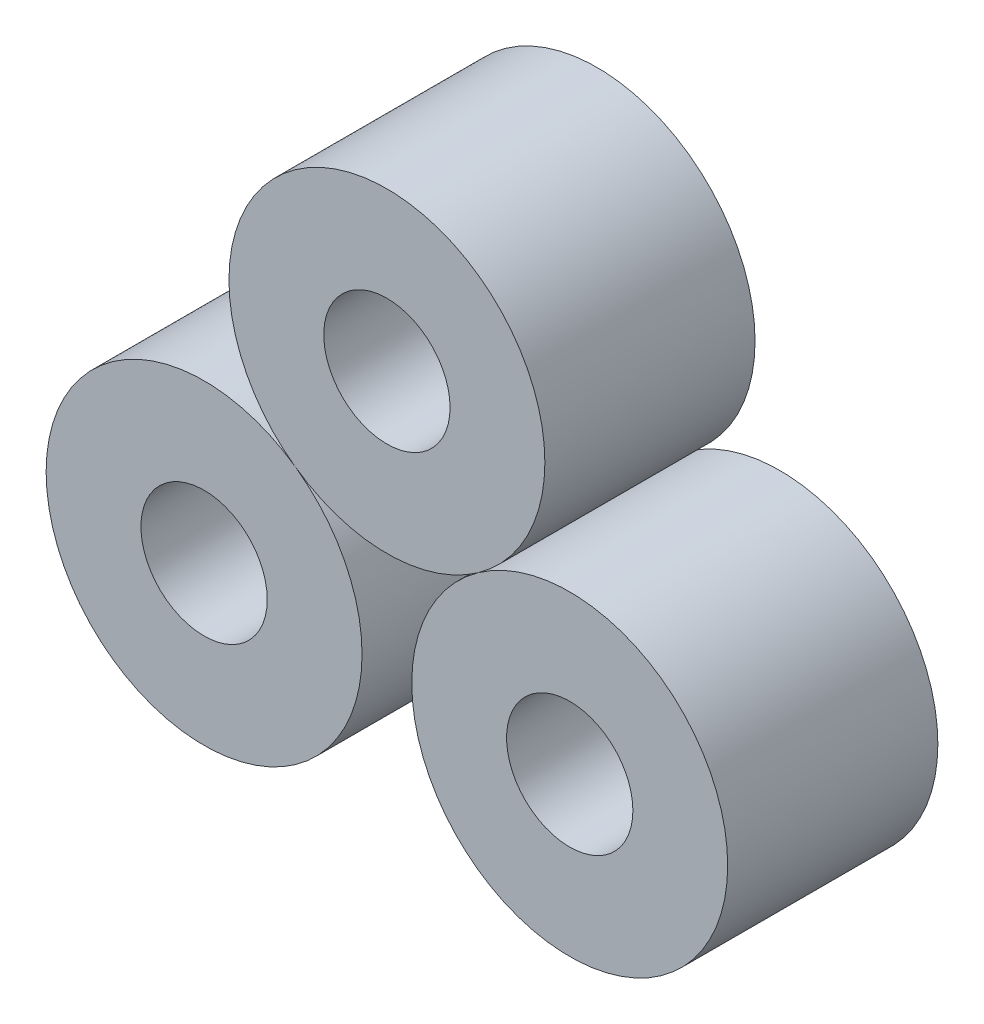
ISO-10303-21;
HEADER;
FILE_DESCRIPTION(('STEP AP214'),'2;1');
FILE_NAME('part.step','',(''),(''),'','','');
FILE_SCHEMA(('AUTOMOTIVE_DESIGN { 1 0 10303 214 1 1 1 1 }'));
ENDSEC;
DATA;
#1=APPLICATION_CONTEXT('core data for automotive mechanical design processes');
#2=APPLICATION_PROTOCOL_DEFINITION('international standard','automotive_design',2000,#1);
#3=PRODUCT_CONTEXT('',#1,'mechanical');
#4=PRODUCT('Part','Part','',(#3));
#5=PRODUCT_RELATED_PRODUCT_CATEGORY('part','',(#4));
#6=PRODUCT_DEFINITION_FORMATION('','',#4);
#7=PRODUCT_DEFINITION_CONTEXT('part definition',#1,'design');
#8=PRODUCT_DEFINITION('design','',#6,#7);
#9=PRODUCT_DEFINITION_SHAPE('','',#8);
#10=(LENGTH_UNIT() NAMED_UNIT(*) SI_UNIT(.MILLI.,.METRE.));
#11=(NAMED_UNIT(*) PLANE_ANGLE_UNIT() SI_UNIT($,.RADIAN.));
#12=(NAMED_UNIT(*) SI_UNIT($,.STERADIAN.) SOLID_ANGLE_UNIT());
#13=UNCERTAINTY_MEASURE_WITH_UNIT(LENGTH_MEASURE(1.E-05),#10,'distance_accuracy_value','');
#14=(GEOMETRIC_REPRESENTATION_CONTEXT(3) GLOBAL_UNCERTAINTY_ASSIGNED_CONTEXT((#13)) GLOBAL_UNIT_ASSIGNED_CONTEXT((#10,
#11,#12)) REPRESENTATION_CONTEXT('',''));
#15=CARTESIAN_POINT('',(0.,0.,0.));
#16=DIRECTION('',(0.,0.,1.));
#17=DIRECTION('',(1.,0.,0.));
#18=AXIS2_PLACEMENT_3D('',#15,#16,#17);
#19=CARTESIAN_POINT('',(2206.,0.,1268.));
#20=DIRECTION('',(0.,0.,1.));
#21=DIRECTION('',(1.,0.,0.));
#22=AXIS2_PLACEMENT_3D('',#19,#20,#21);
#23=PLANE('',#22);
#24=CARTESIAN_POINT('',(2206.,0.,1268.));
#25=DIRECTION('',(0.,0.,1.));
#26=DIRECTION('',(1.,0.,0.));
#27=AXIS2_PLACEMENT_3D('',#24,#25,#26);
#28=CIRCLE('',#27,953.);
#29=CARTESIAN_POINT('',(3159.,0.,1268.));
#30=VERTEX_POINT('',#29);
#31=EDGE_CURVE('E88',#30,#30,#28,.T.);
#32=ORIENTED_EDGE('',*,*,#31,.T.);
#33=EDGE_LOOP('',(#32));
#34=FACE_BOUND('',#33,.T.);
#35=CARTESIAN_POINT('',(2206.,0.,1268.));
#36=DIRECTION('',(0.,0.,1.));
#37=DIRECTION('',(1.,0.,0.));
#38=AXIS2_PLACEMENT_3D('',#35,#36,#37);
#39=CIRCLE('',#38,381.);
#40=CARTESIAN_POINT('',(2587.,0.,1268.));
#41=VERTEX_POINT('',#40);
#42=EDGE_CURVE('E79',#41,#41,#39,.T.);
#43=ORIENTED_EDGE('',*,*,#42,.F.);
#44=EDGE_LOOP('',(#43));
#45=FACE_BOUND('',#44,.T.);
#46=ADVANCED_FACE('F75',(#34,#45),#23,.T.);
#47=CARTESIAN_POINT('',(2206.,0.,0.));
#48=DIRECTION('',(0.,0.,1.));
#49=DIRECTION('',(1.,0.,0.));
#50=AXIS2_PLACEMENT_3D('',#47,#48,#49);
#51=PLANE('',#50);
#52=CARTESIAN_POINT('',(2206.,0.,0.));
#53=DIRECTION('',(0.,0.,1.));
#54=DIRECTION('',(1.,0.,0.));
#55=AXIS2_PLACEMENT_3D('',#52,#53,#54);
#56=CIRCLE('',#55,953.);
#57=CARTESIAN_POINT('',(3159.,0.,0.));
#58=VERTEX_POINT('',#57);
#59=EDGE_CURVE('E86',#58,#58,#56,.T.);
#60=ORIENTED_EDGE('',*,*,#59,.F.);
#61=EDGE_LOOP('',(#60));
#62=FACE_BOUND('',#61,.T.);
#63=CARTESIAN_POINT('',(2206.,0.,0.));
#64=DIRECTION('',(0.,0.,1.));
#65=DIRECTION('',(1.,0.,0.));
#66=AXIS2_PLACEMENT_3D('',#63,#64,#65);
#67=CIRCLE('',#66,381.);
#68=CARTESIAN_POINT('',(2587.,0.,0.));
#69=VERTEX_POINT('',#68);
#70=EDGE_CURVE('E12',#69,#69,#67,.T.);
#71=ORIENTED_EDGE('',*,*,#70,.T.);
#72=EDGE_LOOP('',(#71));
#73=FACE_BOUND('',#72,.T.);
#74=ADVANCED_FACE('F97',(#62,#73),#51,.F.);
#75=CARTESIAN_POINT('',(2206.,0.,1268.));
#76=DIRECTION('',(0.,0.,-1.));
#77=DIRECTION('',(-1.,0.,0.));
#78=AXIS2_PLACEMENT_3D('',#75,#76,#77);
#79=CYLINDRICAL_SURFACE('',#78,953.);
#80=ORIENTED_EDGE('',*,*,#59,.T.);
#81=EDGE_LOOP('',(#80));
#82=FACE_BOUND('',#81,.T.);
#83=ORIENTED_EDGE('',*,*,#31,.F.);
#84=EDGE_LOOP('',(#83));
#85=FACE_BOUND('',#84,.T.);
#86=ADVANCED_FACE('F94',(#82,#85),#79,.T.);
#87=CARTESIAN_POINT('',(2206.,0.,1268.));
#88=DIRECTION('',(0.,0.,-1.));
#89=DIRECTION('',(-1.,0.,0.));
#90=AXIS2_PLACEMENT_3D('',#87,#88,#89);
#91=CYLINDRICAL_SURFACE('',#90,381.);
#92=ORIENTED_EDGE('',*,*,#42,.T.);
#93=EDGE_LOOP('',(#92));
#94=FACE_BOUND('',#93,.T.);
#95=ORIENTED_EDGE('',*,*,#70,.F.);
#96=EDGE_LOOP('',(#95));
#97=FACE_BOUND('',#96,.T.);
#98=ADVANCED_FACE('F77',(#94,#97),#91,.F.);
#99=CLOSED_SHELL('',(#46,#74,#86,#98));
#100=MANIFOLD_SOLID_BREP('B2',#99);
#101=CARTESIAN_POINT('',(1103.,1554.42175743908,1268.));
#102=DIRECTION('',(0.,0.,-1.));
#103=DIRECTION('',(-1.,0.,0.));
#104=AXIS2_PLACEMENT_3D('',#101,#102,#103);
#105=CYLINDRICAL_SURFACE('',#104,953.);
#106=CARTESIAN_POINT('',(1103.,1554.42175743908,0.));
#107=DIRECTION('',(0.,0.,1.));
#108=DIRECTION('',(1.,0.,0.));
#109=AXIS2_PLACEMENT_3D('',#106,#107,#108);
#110=CIRCLE('',#109,953.);
#111=CARTESIAN_POINT('',(2056.,1554.42175743908,0.));
#112=VERTEX_POINT('',#111);
#113=EDGE_CURVE('E154',#112,#112,#110,.T.);
#114=ORIENTED_EDGE('',*,*,#113,.T.);
#115=EDGE_LOOP('',(#114));
#116=FACE_BOUND('',#115,.T.);
#117=CARTESIAN_POINT('',(1103.,1554.42175743908,1268.));
#118=DIRECTION('',(0.,0.,1.));
#119=DIRECTION('',(1.,0.,0.));
#120=AXIS2_PLACEMENT_3D('',#117,#118,#119);
#121=CIRCLE('',#120,953.);
#122=CARTESIAN_POINT('',(2056.,1554.42175743908,1268.));
#123=VERTEX_POINT('',#122);
#124=EDGE_CURVE('E156',#123,#123,#121,.T.);
#125=ORIENTED_EDGE('',*,*,#124,.F.);
#126=EDGE_LOOP('',(#125));
#127=FACE_BOUND('',#126,.T.);
#128=ADVANCED_FACE('F143',(#116,#127),#105,.T.);
#129=CARTESIAN_POINT('',(1103.,1554.42175743908,1268.));
#130=DIRECTION('',(0.,0.,1.));
#131=DIRECTION('',(1.,0.,0.));
#132=AXIS2_PLACEMENT_3D('',#129,#130,#131);
#133=PLANE('',#132);
#134=ORIENTED_EDGE('',*,*,#124,.T.);
#135=EDGE_LOOP('',(#134));
#136=FACE_BOUND('',#135,.T.);
#137=CARTESIAN_POINT('',(1103.,1554.42175743908,1268.));
#138=DIRECTION('',(0.,0.,1.));
#139=DIRECTION('',(1.,0.,0.));
#140=AXIS2_PLACEMENT_3D('',#137,#138,#139);
#141=CIRCLE('',#140,381.);
#142=CARTESIAN_POINT('',(1484.,1554.42175743908,1268.));
#143=VERTEX_POINT('',#142);
#144=EDGE_CURVE('E147',#143,#143,#141,.T.);
#145=ORIENTED_EDGE('',*,*,#144,.F.);
#146=EDGE_LOOP('',(#145));
#147=FACE_BOUND('',#146,.T.);
#148=ADVANCED_FACE('F166',(#136,#147),#133,.T.);
#149=CARTESIAN_POINT('',(1103.,1554.42175743908,0.));
#150=DIRECTION('',(0.,0.,1.));
#151=DIRECTION('',(1.,0.,0.));
#152=AXIS2_PLACEMENT_3D('',#149,#150,#151);
#153=PLANE('',#152);
#154=ORIENTED_EDGE('',*,*,#113,.F.);
#155=EDGE_LOOP('',(#154));
#156=FACE_BOUND('',#155,.T.);
#157=CARTESIAN_POINT('',(1103.,1554.42175743908,0.));
#158=DIRECTION('',(0.,0.,1.));
#159=DIRECTION('',(1.,0.,0.));
#160=AXIS2_PLACEMENT_3D('',#157,#158,#159);
#161=CIRCLE('',#160,381.);
#162=CARTESIAN_POINT('',(1484.,1554.42175743908,0.));
#163=VERTEX_POINT('',#162);
#164=EDGE_CURVE('E74',#163,#163,#161,.T.);
#165=ORIENTED_EDGE('',*,*,#164,.T.);
#166=EDGE_LOOP('',(#165));
#167=FACE_BOUND('',#166,.T.);
#168=ADVANCED_FACE('F164',(#156,#167),#153,.F.);
#169=CARTESIAN_POINT('',(1103.,1554.42175743908,1268.));
#170=DIRECTION('',(0.,0.,-1.));
#171=DIRECTION('',(-1.,0.,0.));
#172=AXIS2_PLACEMENT_3D('',#169,#170,#171);
#173=CYLINDRICAL_SURFACE('',#172,381.);
#174=ORIENTED_EDGE('',*,*,#144,.T.);
#175=EDGE_LOOP('',(#174));
#176=FACE_BOUND('',#175,.T.);
#177=ORIENTED_EDGE('',*,*,#164,.F.);
#178=EDGE_LOOP('',(#177));
#179=FACE_BOUND('',#178,.T.);
#180=ADVANCED_FACE('F145',(#176,#179),#173,.F.);
#181=CLOSED_SHELL('',(#128,#148,#168,#180));
#182=MANIFOLD_SOLID_BREP('B7',#181);
#183=CARTESIAN_POINT('',(0.,0.,1268.));
#184=DIRECTION('',(0.,0.,1.));
#185=DIRECTION('',(1.,0.,0.));
#186=AXIS2_PLACEMENT_3D('',#183,#184,#185);
#187=PLANE('',#186);
#188=CARTESIAN_POINT('',(0.,0.,1268.));
#189=DIRECTION('',(0.,0.,1.));
#190=DIRECTION('',(1.,0.,0.));
#191=AXIS2_PLACEMENT_3D('',#188,#189,#190);
#192=CIRCLE('',#191,953.);
#193=CARTESIAN_POINT('',(953.,0.,1268.));
#194=VERTEX_POINT('',#193);
#195=EDGE_CURVE('E142',#194,#194,#192,.T.);
#196=ORIENTED_EDGE('',*,*,#195,.T.);
#197=EDGE_LOOP('',(#196));
#198=FACE_BOUND('',#197,.T.);
#199=CARTESIAN_POINT('',(0.,0.,1268.));
#200=DIRECTION('',(0.,0.,1.));
#201=DIRECTION('',(1.,0.,0.));
#202=AXIS2_PLACEMENT_3D('',#199,#200,#201);
#203=CIRCLE('',#202,381.);
#204=CARTESIAN_POINT('',(381.,0.,1268.));
#205=VERTEX_POINT('',#204);
#206=EDGE_CURVE('E215',#205,#205,#203,.T.);
#207=ORIENTED_EDGE('',*,*,#206,.F.);
#208=EDGE_LOOP('',(#207));
#209=FACE_BOUND('',#208,.T.);
#210=ADVANCED_FACE('F204',(#198,#209),#187,.T.);
#211=CARTESIAN_POINT('',(0.,0.,0.));
#212=DIRECTION('',(0.,0.,1.));
#213=DIRECTION('',(1.,0.,0.));
#214=AXIS2_PLACEMENT_3D('',#211,#212,#213);
#215=PLANE('',#214);
#216=CARTESIAN_POINT('',(0.,0.,0.));
#217=DIRECTION('',(0.,0.,1.));
#218=DIRECTION('',(1.,0.,0.));
#219=AXIS2_PLACEMENT_3D('',#216,#217,#218);
#220=CIRCLE('',#219,953.);
#221=CARTESIAN_POINT('',(953.,0.,0.));
#222=VERTEX_POINT('',#221);
#223=EDGE_CURVE('E208',#222,#222,#220,.T.);
#224=ORIENTED_EDGE('',*,*,#223,.F.);
#225=EDGE_LOOP('',(#224));
#226=FACE_BOUND('',#225,.T.);
#227=CARTESIAN_POINT('',(0.,0.,0.));
#228=DIRECTION('',(0.,0.,1.));
#229=DIRECTION('',(1.,0.,0.));
#230=AXIS2_PLACEMENT_3D('',#227,#228,#229);
#231=CIRCLE('',#230,381.);
#232=CARTESIAN_POINT('',(381.,0.,0.));
#233=VERTEX_POINT('',#232);
#234=EDGE_CURVE('E217',#233,#233,#231,.T.);
#235=ORIENTED_EDGE('',*,*,#234,.T.);
#236=EDGE_LOOP('',(#235));
#237=FACE_BOUND('',#236,.T.);
#238=ADVANCED_FACE('F227',(#226,#237),#215,.F.);
#239=CARTESIAN_POINT('',(0.,0.,1268.));
#240=DIRECTION('',(0.,0.,-1.));
#241=DIRECTION('',(-1.,0.,0.));
#242=AXIS2_PLACEMENT_3D('',#239,#240,#241);
#243=CYLINDRICAL_SURFACE('',#242,953.);
#244=ORIENTED_EDGE('',*,*,#223,.T.);
#245=EDGE_LOOP('',(#244));
#246=FACE_BOUND('',#245,.T.);
#247=ORIENTED_EDGE('',*,*,#195,.F.);
#248=EDGE_LOOP('',(#247));
#249=FACE_BOUND('',#248,.T.);
#250=ADVANCED_FACE('F206',(#246,#249),#243,.T.);
#251=CARTESIAN_POINT('',(0.,0.,1268.));
#252=DIRECTION('',(0.,0.,-1.));
#253=DIRECTION('',(-1.,0.,0.));
#254=AXIS2_PLACEMENT_3D('',#251,#252,#253);
#255=CYLINDRICAL_SURFACE('',#254,381.);
#256=ORIENTED_EDGE('',*,*,#206,.T.);
#257=EDGE_LOOP('',(#256));
#258=FACE_BOUND('',#257,.T.);
#259=ORIENTED_EDGE('',*,*,#234,.F.);
#260=EDGE_LOOP('',(#259));
#261=FACE_BOUND('',#260,.T.);
#262=ADVANCED_FACE('F223',(#258,#261),#255,.F.);
#263=CLOSED_SHELL('',(#210,#238,#250,#262));
#264=MANIFOLD_SOLID_BREP('B69',#263);
#265=ADVANCED_BREP_SHAPE_REPRESENTATION('',(#18,#100,#182,#264),#14);
#266=SHAPE_DEFINITION_REPRESENTATION(#9,#265);
ENDSEC;
END-ISO-10303-21;
